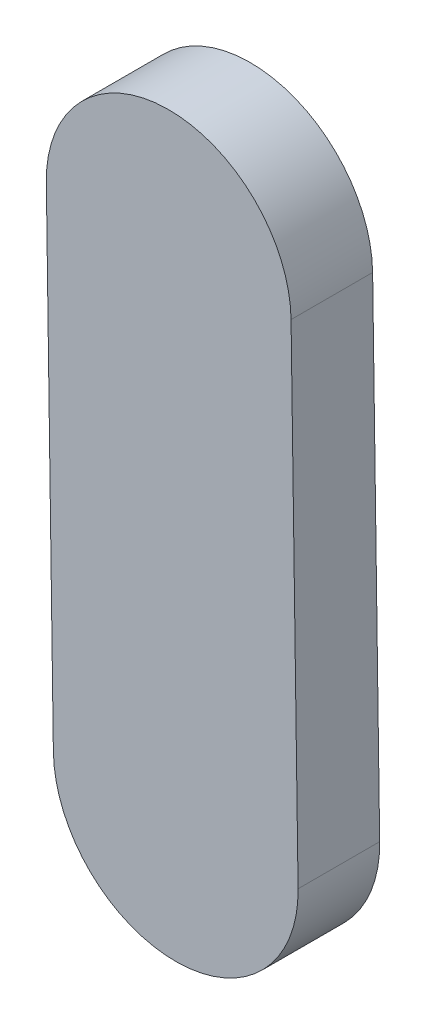
ISO-10303-21;
HEADER;
FILE_DESCRIPTION(('STEP AP214'),'2;1');
FILE_NAME('part.step','',(''),(''),'','','');
FILE_SCHEMA(('AUTOMOTIVE_DESIGN { 1 0 10303 214 1 1 1 1 }'));
ENDSEC;
DATA;
#1=APPLICATION_CONTEXT('core data for automotive mechanical design processes');
#2=APPLICATION_PROTOCOL_DEFINITION('international standard','automotive_design',2000,#1);
#3=PRODUCT_CONTEXT('',#1,'mechanical');
#4=PRODUCT('Part','Part','',(#3));
#5=PRODUCT_RELATED_PRODUCT_CATEGORY('part','',(#4));
#6=PRODUCT_DEFINITION_FORMATION('','',#4);
#7=PRODUCT_DEFINITION_CONTEXT('part definition',#1,'design');
#8=PRODUCT_DEFINITION('design','',#6,#7);
#9=PRODUCT_DEFINITION_SHAPE('','',#8);
#10=(LENGTH_UNIT() NAMED_UNIT(*) SI_UNIT(.MILLI.,.METRE.));
#11=(NAMED_UNIT(*) PLANE_ANGLE_UNIT() SI_UNIT($,.RADIAN.));
#12=(NAMED_UNIT(*) SI_UNIT($,.STERADIAN.) SOLID_ANGLE_UNIT());
#13=UNCERTAINTY_MEASURE_WITH_UNIT(LENGTH_MEASURE(1.E-05),#10,'distance_accuracy_value','');
#14=(GEOMETRIC_REPRESENTATION_CONTEXT(3) GLOBAL_UNCERTAINTY_ASSIGNED_CONTEXT((#13)) GLOBAL_UNIT_ASSIGNED_CONTEXT((#10,
#11,#12)) REPRESENTATION_CONTEXT('',''));
#15=CARTESIAN_POINT('',(0.,0.,0.));
#16=DIRECTION('',(0.,0.,1.));
#17=DIRECTION('',(1.,0.,0.));
#18=AXIS2_PLACEMENT_3D('',#15,#16,#17);
#19=CARTESIAN_POINT('',(-3.87722109118069,6.21692402097923,1.));
#20=DIRECTION('',(0.,0.,-1.));
#21=DIRECTION('',(-1.,0.,0.));
#22=AXIS2_PLACEMENT_3D('',#19,#20,#21);
#23=CYLINDRICAL_SURFACE('',#22,1.50015452147031);
#24=CARTESIAN_POINT('',(-3.87722109118069,6.21692402097923,0.));
#25=DIRECTION('',(0.,0.,1.));
#26=DIRECTION('',(1.,0.,0.));
#27=AXIS2_PLACEMENT_3D('',#24,#25,#26);
#28=CIRCLE('',#27,1.50015452147031);
#29=CARTESIAN_POINT('',(-2.37722109118069,6.2384551214577,0.));
#30=VERTEX_POINT('',#29);
#31=CARTESIAN_POINT('',(-5.37722109118069,6.19539292050077,0.));
#32=VERTEX_POINT('',#31);
#33=EDGE_CURVE('E102',#30,#32,#28,.T.);
#34=ORIENTED_EDGE('',*,*,#33,.T.);
#35=DIRECTION('',(0.,0.,-1.));
#36=VECTOR('',#35,1.);
#37=CARTESIAN_POINT('',(-5.37722109118069,6.19539292050077,1.));
#38=LINE('',#37,#36);
#39=CARTESIAN_POINT('',(-5.37722109118069,6.19539292050077,1.));
#40=VERTEX_POINT('',#39);
#41=EDGE_CURVE('E11',#40,#32,#38,.T.);
#42=ORIENTED_EDGE('',*,*,#41,.F.);
#43=CARTESIAN_POINT('',(-3.87722109118069,6.21692402097923,1.));
#44=DIRECTION('',(0.,0.,1.));
#45=DIRECTION('',(1.,0.,0.));
#46=AXIS2_PLACEMENT_3D('',#43,#44,#45);
#47=CIRCLE('',#46,1.50015452147031);
#48=CARTESIAN_POINT('',(-2.37722109118069,6.2384551214577,1.));
#49=VERTEX_POINT('',#48);
#50=EDGE_CURVE('E90',#49,#40,#47,.T.);
#51=ORIENTED_EDGE('',*,*,#50,.F.);
#52=DIRECTION('',(0.,0.,-1.));
#53=VECTOR('',#52,1.);
#54=CARTESIAN_POINT('',(-2.37722109118069,6.2384551214577,1.));
#55=LINE('',#54,#53);
#56=EDGE_CURVE('E98',#49,#30,#55,.T.);
#57=ORIENTED_EDGE('',*,*,#56,.T.);
#58=EDGE_LOOP('',(#34,#42,#51,#57));
#59=FACE_BOUND('',#58,.T.);
#60=ADVANCED_FACE('F39',(#59),#23,.T.);
#61=CARTESIAN_POINT('',(-5.37722109118069,6.19539292050077,1.));
#62=DIRECTION('',(0.999896996297316,0.0143525884635975,0.));
#63=DIRECTION('',(-0.0143525884635975,0.999896996297316,0.));
#64=AXIS2_PLACEMENT_3D('',#61,#62,#63);
#65=PLANE('',#64);
#66=DIRECTION('',(0.0143525884635975,-0.999896996297316,0.));
#67=VECTOR('',#66,1.);
#68=CARTESIAN_POINT('',(-5.37722109118069,6.19539292050077,0.));
#69=LINE('',#68,#67);
#70=CARTESIAN_POINT('',(-5.29109668926681,0.195392920500767,0.));
#71=VERTEX_POINT('',#70);
#72=EDGE_CURVE('E94',#32,#71,#69,.T.);
#73=ORIENTED_EDGE('',*,*,#72,.T.);
#74=DIRECTION('',(0.,0.,-1.));
#75=VECTOR('',#74,1.);
#76=CARTESIAN_POINT('',(-5.29109668926681,0.195392920500767,1.));
#77=LINE('',#76,#75);
#78=CARTESIAN_POINT('',(-5.29109668926681,0.195392920500767,1.));
#79=VERTEX_POINT('',#78);
#80=EDGE_CURVE('E47',#79,#71,#77,.T.);
#81=ORIENTED_EDGE('',*,*,#80,.F.);
#82=DIRECTION('',(0.0143525884635975,-0.999896996297316,0.));
#83=VECTOR('',#82,1.);
#84=CARTESIAN_POINT('',(-5.37722109118069,6.19539292050077,1.));
#85=LINE('',#84,#83);
#86=EDGE_CURVE('E85',#40,#79,#85,.T.);
#87=ORIENTED_EDGE('',*,*,#86,.F.);
#88=ORIENTED_EDGE('',*,*,#41,.T.);
#89=EDGE_LOOP('',(#73,#81,#87,#88));
#90=FACE_BOUND('',#89,.T.);
#91=ADVANCED_FACE('F93',(#90),#65,.F.);
#92=CARTESIAN_POINT('',(-3.79109668926681,0.216924020979235,1.));
#93=DIRECTION('',(0.,0.,-1.));
#94=DIRECTION('',(-1.,0.,0.));
#95=AXIS2_PLACEMENT_3D('',#92,#93,#94);
#96=CYLINDRICAL_SURFACE('',#95,1.50015452147031);
#97=CARTESIAN_POINT('',(-3.79109668926681,0.216924020979235,0.));
#98=DIRECTION('',(0.,0.,1.));
#99=DIRECTION('',(1.,0.,0.));
#100=AXIS2_PLACEMENT_3D('',#97,#98,#99);
#101=CIRCLE('',#100,1.50015452147031);
#102=CARTESIAN_POINT('',(-2.29109668926681,0.238455121457704,0.));
#103=VERTEX_POINT('',#102);
#104=EDGE_CURVE('E72',#71,#103,#101,.T.);
#105=ORIENTED_EDGE('',*,*,#104,.T.);
#106=DIRECTION('',(0.,0.,-1.));
#107=VECTOR('',#106,1.);
#108=CARTESIAN_POINT('',(-2.29109668926681,0.238455121457704,1.));
#109=LINE('',#108,#107);
#110=CARTESIAN_POINT('',(-2.29109668926681,0.238455121457704,1.));
#111=VERTEX_POINT('',#110);
#112=EDGE_CURVE('E95',#111,#103,#109,.T.);
#113=ORIENTED_EDGE('',*,*,#112,.F.);
#114=CARTESIAN_POINT('',(-3.79109668926681,0.216924020979235,1.));
#115=DIRECTION('',(0.,0.,1.));
#116=DIRECTION('',(1.,0.,0.));
#117=AXIS2_PLACEMENT_3D('',#114,#115,#116);
#118=CIRCLE('',#117,1.50015452147031);
#119=EDGE_CURVE('E88',#79,#111,#118,.T.);
#120=ORIENTED_EDGE('',*,*,#119,.F.);
#121=ORIENTED_EDGE('',*,*,#80,.T.);
#122=EDGE_LOOP('',(#105,#113,#120,#121));
#123=FACE_BOUND('',#122,.T.);
#124=ADVANCED_FACE('F96',(#123),#96,.T.);
#125=CARTESIAN_POINT('',(-2.37722109118069,6.2384551214577,1.));
#126=DIRECTION('',(-0.999896996297316,-0.0143525884635977,0.));
#127=DIRECTION('',(0.0143525884635977,-0.999896996297316,0.));
#128=AXIS2_PLACEMENT_3D('',#125,#126,#127);
#129=PLANE('',#128);
#130=DIRECTION('',(-0.0143525884635977,0.999896996297316,0.));
#131=VECTOR('',#130,1.);
#132=CARTESIAN_POINT('',(-2.37722109118069,6.2384551214577,0.));
#133=LINE('',#132,#131);
#134=EDGE_CURVE('E78',#103,#30,#133,.T.);
#135=ORIENTED_EDGE('',*,*,#134,.T.);
#136=ORIENTED_EDGE('',*,*,#56,.F.);
#137=DIRECTION('',(-0.0143525884635977,0.999896996297316,0.));
#138=VECTOR('',#137,1.);
#139=CARTESIAN_POINT('',(-2.37722109118069,6.2384551214577,1.));
#140=LINE('',#139,#138);
#141=EDGE_CURVE('E55',#111,#49,#140,.T.);
#142=ORIENTED_EDGE('',*,*,#141,.F.);
#143=ORIENTED_EDGE('',*,*,#112,.T.);
#144=EDGE_LOOP('',(#135,#136,#142,#143));
#145=FACE_BOUND('',#144,.T.);
#146=ADVANCED_FACE('F109',(#145),#129,.F.);
#147=CARTESIAN_POINT('',(-3.87722109118069,6.21692402097923,1.));
#148=DIRECTION('',(0.,0.,1.));
#149=DIRECTION('',(1.,0.,0.));
#150=AXIS2_PLACEMENT_3D('',#147,#148,#149);
#151=PLANE('',#150);
#152=ORIENTED_EDGE('',*,*,#50,.T.);
#153=ORIENTED_EDGE('',*,*,#86,.T.);
#154=ORIENTED_EDGE('',*,*,#119,.T.);
#155=ORIENTED_EDGE('',*,*,#141,.T.);
#156=EDGE_LOOP('',(#152,#153,#154,#155));
#157=FACE_BOUND('',#156,.T.);
#158=ADVANCED_FACE('F86',(#157),#151,.T.);
#159=CARTESIAN_POINT('',(-3.87722109118069,6.21692402097923,0.));
#160=DIRECTION('',(0.,0.,1.));
#161=DIRECTION('',(1.,0.,0.));
#162=AXIS2_PLACEMENT_3D('',#159,#160,#161);
#163=PLANE('',#162);
#164=ORIENTED_EDGE('',*,*,#33,.F.);
#165=ORIENTED_EDGE('',*,*,#134,.F.);
#166=ORIENTED_EDGE('',*,*,#104,.F.);
#167=ORIENTED_EDGE('',*,*,#72,.F.);
#168=EDGE_LOOP('',(#164,#165,#166,#167));
#169=FACE_BOUND('',#168,.T.);
#170=ADVANCED_FACE('F112',(#169),#163,.F.);
#171=CLOSED_SHELL('',(#60,#91,#124,#146,#158,#170));
#172=MANIFOLD_SOLID_BREP('B2',#171);
#173=ADVANCED_BREP_SHAPE_REPRESENTATION('',(#18,#172),#14);
#174=SHAPE_DEFINITION_REPRESENTATION(#9,#173);
ENDSEC;
END-ISO-10303-21;
